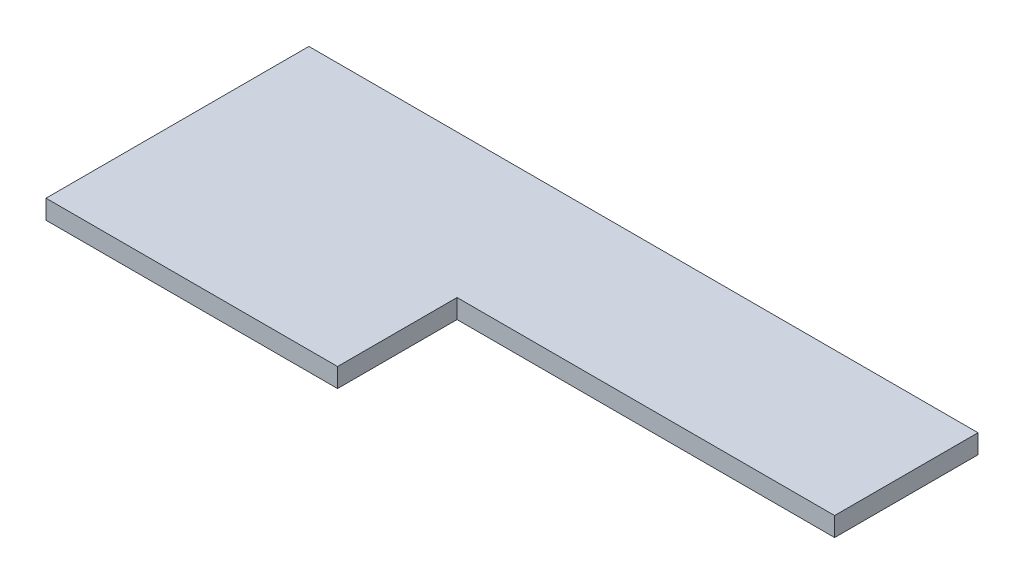
ISO-10303-21;
HEADER;
FILE_DESCRIPTION(('STEP AP214'),'2;1');
FILE_NAME('part.step','',(''),(''),'','','');
FILE_SCHEMA(('AUTOMOTIVE_DESIGN { 1 0 10303 214 1 1 1 1 }'));
ENDSEC;
DATA;
#1=APPLICATION_CONTEXT('core data for automotive mechanical design processes');
#2=APPLICATION_PROTOCOL_DEFINITION('international standard','automotive_design',2000,#1);
#3=PRODUCT_CONTEXT('',#1,'mechanical');
#4=PRODUCT('Part','Part','',(#3));
#5=PRODUCT_RELATED_PRODUCT_CATEGORY('part','',(#4));
#6=PRODUCT_DEFINITION_FORMATION('','',#4);
#7=PRODUCT_DEFINITION_CONTEXT('part definition',#1,'design');
#8=PRODUCT_DEFINITION('design','',#6,#7);
#9=PRODUCT_DEFINITION_SHAPE('','',#8);
#10=(LENGTH_UNIT() NAMED_UNIT(*) SI_UNIT(.MILLI.,.METRE.));
#11=(NAMED_UNIT(*) PLANE_ANGLE_UNIT() SI_UNIT($,.RADIAN.));
#12=(NAMED_UNIT(*) SI_UNIT($,.STERADIAN.) SOLID_ANGLE_UNIT());
#13=UNCERTAINTY_MEASURE_WITH_UNIT(LENGTH_MEASURE(1.E-05),#10,'distance_accuracy_value','');
#14=(GEOMETRIC_REPRESENTATION_CONTEXT(3) GLOBAL_UNCERTAINTY_ASSIGNED_CONTEXT((#13)) GLOBAL_UNIT_ASSIGNED_CONTEXT((#10,
#11,#12)) REPRESENTATION_CONTEXT('',''));
#15=CARTESIAN_POINT('',(0.,0.,0.));
#16=DIRECTION('',(0.,0.,1.));
#17=DIRECTION('',(1.,0.,0.));
#18=AXIS2_PLACEMENT_3D('',#15,#16,#17);
#19=CARTESIAN_POINT('',(-55.9196787148594,4.,33.7248995983936));
#20=DIRECTION('',(1.,0.,0.));
#21=DIRECTION('',(0.,0.,-1.));
#22=AXIS2_PLACEMENT_3D('',#19,#20,#21);
#23=PLANE('',#22);
#24=DIRECTION('',(0.,0.,1.));
#25=VECTOR('',#24,1.);
#26=CARTESIAN_POINT('',(-55.9196787148594,0.,33.7248995983936));
#27=LINE('',#26,#25);
#28=CARTESIAN_POINT('',(-55.9196787148595,0.,-21.2751004016064));
#29=VERTEX_POINT('',#28);
#30=CARTESIAN_POINT('',(-55.9196787148594,0.,33.7248995983936));
#31=VERTEX_POINT('',#30);
#32=EDGE_CURVE('E117',#29,#31,#27,.T.);
#33=ORIENTED_EDGE('',*,*,#32,.T.);
#34=DIRECTION('',(0.,-1.,0.));
#35=VECTOR('',#34,1.);
#36=CARTESIAN_POINT('',(-55.9196787148594,4.,33.7248995983936));
#37=LINE('',#36,#35);
#38=CARTESIAN_POINT('',(-55.9196787148594,4.,33.7248995983936));
#39=VERTEX_POINT('',#38);
#40=EDGE_CURVE('E11',#39,#31,#37,.T.);
#41=ORIENTED_EDGE('',*,*,#40,.F.);
#42=DIRECTION('',(0.,0.,1.));
#43=VECTOR('',#42,1.);
#44=CARTESIAN_POINT('',(-55.9196787148594,4.,33.7248995983936));
#45=LINE('',#44,#43);
#46=CARTESIAN_POINT('',(-55.9196787148595,4.,-21.2751004016064));
#47=VERTEX_POINT('',#46);
#48=EDGE_CURVE('E127',#47,#39,#45,.T.);
#49=ORIENTED_EDGE('',*,*,#48,.F.);
#50=DIRECTION('',(0.,-1.,0.));
#51=VECTOR('',#50,1.);
#52=CARTESIAN_POINT('',(-55.9196787148595,4.,-21.2751004016064));
#53=LINE('',#52,#51);
#54=EDGE_CURVE('E113',#47,#29,#53,.T.);
#55=ORIENTED_EDGE('',*,*,#54,.T.);
#56=EDGE_LOOP('',(#33,#41,#49,#55));
#57=FACE_BOUND('',#56,.T.);
#58=ADVANCED_FACE('F33',(#57),#23,.F.);
#59=CARTESIAN_POINT('',(5.08032128514056,4.,33.7248995983936));
#60=DIRECTION('',(0.,0.,-1.));
#61=DIRECTION('',(-1.,0.,0.));
#62=AXIS2_PLACEMENT_3D('',#59,#60,#61);
#63=PLANE('',#62);
#64=DIRECTION('',(1.,0.,0.));
#65=VECTOR('',#64,1.);
#66=CARTESIAN_POINT('',(5.08032128514056,0.,33.7248995983936));
#67=LINE('',#66,#65);
#68=CARTESIAN_POINT('',(5.08032128514056,0.,33.7248995983936));
#69=VERTEX_POINT('',#68);
#70=EDGE_CURVE('E120',#31,#69,#67,.T.);
#71=ORIENTED_EDGE('',*,*,#70,.T.);
#72=DIRECTION('',(0.,-1.,0.));
#73=VECTOR('',#72,1.);
#74=CARTESIAN_POINT('',(5.08032128514056,4.,33.7248995983936));
#75=LINE('',#74,#73);
#76=CARTESIAN_POINT('',(5.08032128514056,4.,33.7248995983936));
#77=VERTEX_POINT('',#76);
#78=EDGE_CURVE('E41',#77,#69,#75,.T.);
#79=ORIENTED_EDGE('',*,*,#78,.F.);
#80=DIRECTION('',(1.,0.,0.));
#81=VECTOR('',#80,1.);
#82=CARTESIAN_POINT('',(5.08032128514056,4.,33.7248995983936));
#83=LINE('',#82,#81);
#84=EDGE_CURVE('E86',#39,#77,#83,.T.);
#85=ORIENTED_EDGE('',*,*,#84,.F.);
#86=ORIENTED_EDGE('',*,*,#40,.T.);
#87=EDGE_LOOP('',(#71,#79,#85,#86));
#88=FACE_BOUND('',#87,.T.);
#89=ADVANCED_FACE('F151',(#88),#63,.F.);
#90=CARTESIAN_POINT('',(5.08032128514055,4.,8.72489959839358));
#91=DIRECTION('',(-1.,0.,0.));
#92=DIRECTION('',(0.,0.,1.));
#93=AXIS2_PLACEMENT_3D('',#90,#91,#92);
#94=PLANE('',#93);
#95=DIRECTION('',(0.,0.,-1.));
#96=VECTOR('',#95,1.);
#97=CARTESIAN_POINT('',(5.08032128514055,0.,8.72489959839358));
#98=LINE('',#97,#96);
#99=CARTESIAN_POINT('',(5.08032128514055,0.,8.72489959839358));
#100=VERTEX_POINT('',#99);
#101=EDGE_CURVE('E122',#69,#100,#98,.T.);
#102=ORIENTED_EDGE('',*,*,#101,.T.);
#103=DIRECTION('',(0.,-1.,0.));
#104=VECTOR('',#103,1.);
#105=CARTESIAN_POINT('',(5.08032128514055,4.,8.72489959839358));
#106=LINE('',#105,#104);
#107=CARTESIAN_POINT('',(5.08032128514055,4.,8.72489959839358));
#108=VERTEX_POINT('',#107);
#109=EDGE_CURVE('E108',#108,#100,#106,.T.);
#110=ORIENTED_EDGE('',*,*,#109,.F.);
#111=DIRECTION('',(0.,0.,-1.));
#112=VECTOR('',#111,1.);
#113=CARTESIAN_POINT('',(5.08032128514055,4.,8.72489959839358));
#114=LINE('',#113,#112);
#115=EDGE_CURVE('E99',#77,#108,#114,.T.);
#116=ORIENTED_EDGE('',*,*,#115,.F.);
#117=ORIENTED_EDGE('',*,*,#78,.T.);
#118=EDGE_LOOP('',(#102,#110,#116,#117));
#119=FACE_BOUND('',#118,.T.);
#120=ADVANCED_FACE('F133',(#119),#94,.F.);
#121=CARTESIAN_POINT('',(84.0803212851406,4.,8.72489959839357));
#122=DIRECTION('',(0.,0.,-1.));
#123=DIRECTION('',(-1.,0.,0.));
#124=AXIS2_PLACEMENT_3D('',#121,#122,#123);
#125=PLANE('',#124);
#126=DIRECTION('',(1.,0.,0.));
#127=VECTOR('',#126,1.);
#128=CARTESIAN_POINT('',(84.0803212851406,0.,8.72489959839357));
#129=LINE('',#128,#127);
#130=CARTESIAN_POINT('',(84.0803212851406,0.,8.72489959839357));
#131=VERTEX_POINT('',#130);
#132=EDGE_CURVE('E107',#100,#131,#129,.T.);
#133=ORIENTED_EDGE('',*,*,#132,.T.);
#134=DIRECTION('',(0.,-1.,0.));
#135=VECTOR('',#134,1.);
#136=CARTESIAN_POINT('',(84.0803212851406,4.,8.72489959839357));
#137=LINE('',#136,#135);
#138=CARTESIAN_POINT('',(84.0803212851406,4.,8.72489959839357));
#139=VERTEX_POINT('',#138);
#140=EDGE_CURVE('E104',#139,#131,#137,.T.);
#141=ORIENTED_EDGE('',*,*,#140,.F.);
#142=DIRECTION('',(1.,0.,0.));
#143=VECTOR('',#142,1.);
#144=CARTESIAN_POINT('',(84.0803212851406,4.,8.72489959839357));
#145=LINE('',#144,#143);
#146=EDGE_CURVE('E93',#108,#139,#145,.T.);
#147=ORIENTED_EDGE('',*,*,#146,.F.);
#148=ORIENTED_EDGE('',*,*,#109,.T.);
#149=EDGE_LOOP('',(#133,#141,#147,#148));
#150=FACE_BOUND('',#149,.T.);
#151=ADVANCED_FACE('F105',(#150),#125,.F.);
#152=CARTESIAN_POINT('',(84.0803212851406,4.,-21.2751004016064));
#153=DIRECTION('',(-1.,0.,0.));
#154=DIRECTION('',(0.,0.,1.));
#155=AXIS2_PLACEMENT_3D('',#152,#153,#154);
#156=PLANE('',#155);
#157=DIRECTION('',(0.,0.,-1.));
#158=VECTOR('',#157,1.);
#159=CARTESIAN_POINT('',(84.0803212851406,0.,-21.2751004016064));
#160=LINE('',#159,#158);
#161=CARTESIAN_POINT('',(84.0803212851406,0.,-21.2751004016064));
#162=VERTEX_POINT('',#161);
#163=EDGE_CURVE('E72',#131,#162,#160,.T.);
#164=ORIENTED_EDGE('',*,*,#163,.T.);
#165=DIRECTION('',(0.,-1.,0.));
#166=VECTOR('',#165,1.);
#167=CARTESIAN_POINT('',(84.0803212851406,4.,-21.2751004016064));
#168=LINE('',#167,#166);
#169=CARTESIAN_POINT('',(84.0803212851406,4.,-21.2751004016064));
#170=VERTEX_POINT('',#169);
#171=EDGE_CURVE('E109',#170,#162,#168,.T.);
#172=ORIENTED_EDGE('',*,*,#171,.F.);
#173=DIRECTION('',(0.,0.,-1.));
#174=VECTOR('',#173,1.);
#175=CARTESIAN_POINT('',(84.0803212851406,4.,-21.2751004016064));
#176=LINE('',#175,#174);
#177=EDGE_CURVE('E97',#139,#170,#176,.T.);
#178=ORIENTED_EDGE('',*,*,#177,.F.);
#179=ORIENTED_EDGE('',*,*,#140,.T.);
#180=EDGE_LOOP('',(#164,#172,#178,#179));
#181=FACE_BOUND('',#180,.T.);
#182=ADVANCED_FACE('F111',(#181),#156,.F.);
#183=CARTESIAN_POINT('',(-55.9196787148595,4.,-21.2751004016064));
#184=DIRECTION('',(0.,0.,1.));
#185=DIRECTION('',(1.,0.,0.));
#186=AXIS2_PLACEMENT_3D('',#183,#184,#185);
#187=PLANE('',#186);
#188=DIRECTION('',(-1.,0.,0.));
#189=VECTOR('',#188,1.);
#190=CARTESIAN_POINT('',(-55.9196787148595,0.,-21.2751004016064));
#191=LINE('',#190,#189);
#192=EDGE_CURVE('E78',#162,#29,#191,.T.);
#193=ORIENTED_EDGE('',*,*,#192,.T.);
#194=ORIENTED_EDGE('',*,*,#54,.F.);
#195=DIRECTION('',(-1.,0.,0.));
#196=VECTOR('',#195,1.);
#197=CARTESIAN_POINT('',(-55.9196787148595,4.,-21.2751004016064));
#198=LINE('',#197,#196);
#199=EDGE_CURVE('E49',#170,#47,#198,.T.);
#200=ORIENTED_EDGE('',*,*,#199,.F.);
#201=ORIENTED_EDGE('',*,*,#171,.T.);
#202=EDGE_LOOP('',(#193,#194,#200,#201));
#203=FACE_BOUND('',#202,.T.);
#204=ADVANCED_FACE('F140',(#203),#187,.F.);
#205=CARTESIAN_POINT('',(0.,4.,0.));
#206=DIRECTION('',(0.,-1.,0.));
#207=DIRECTION('',(0.,0.,-1.));
#208=AXIS2_PLACEMENT_3D('',#205,#206,#207);
#209=PLANE('',#208);
#210=ORIENTED_EDGE('',*,*,#48,.T.);
#211=ORIENTED_EDGE('',*,*,#84,.T.);
#212=ORIENTED_EDGE('',*,*,#115,.T.);
#213=ORIENTED_EDGE('',*,*,#146,.T.);
#214=ORIENTED_EDGE('',*,*,#177,.T.);
#215=ORIENTED_EDGE('',*,*,#199,.T.);
#216=EDGE_LOOP('',(#210,#211,#212,#213,#214,#215));
#217=FACE_BOUND('',#216,.T.);
#218=ADVANCED_FACE('F95',(#217),#209,.F.);
#219=CARTESIAN_POINT('',(0.,0.,0.));
#220=DIRECTION('',(0.,-1.,0.));
#221=DIRECTION('',(0.,0.,-1.));
#222=AXIS2_PLACEMENT_3D('',#219,#220,#221);
#223=PLANE('',#222);
#224=ORIENTED_EDGE('',*,*,#32,.F.);
#225=ORIENTED_EDGE('',*,*,#192,.F.);
#226=ORIENTED_EDGE('',*,*,#163,.F.);
#227=ORIENTED_EDGE('',*,*,#132,.F.);
#228=ORIENTED_EDGE('',*,*,#101,.F.);
#229=ORIENTED_EDGE('',*,*,#70,.F.);
#230=EDGE_LOOP('',(#224,#225,#226,#227,#228,#229));
#231=FACE_BOUND('',#230,.T.);
#232=ADVANCED_FACE('F136',(#231),#223,.T.);
#233=CLOSED_SHELL('',(#58,#89,#120,#151,#182,#204,#218,#232));
#234=MANIFOLD_SOLID_BREP('B2',#233);
#235=ADVANCED_BREP_SHAPE_REPRESENTATION('',(#18,#234),#14);
#236=SHAPE_DEFINITION_REPRESENTATION(#9,#235);
ENDSEC;
END-ISO-10303-21;
